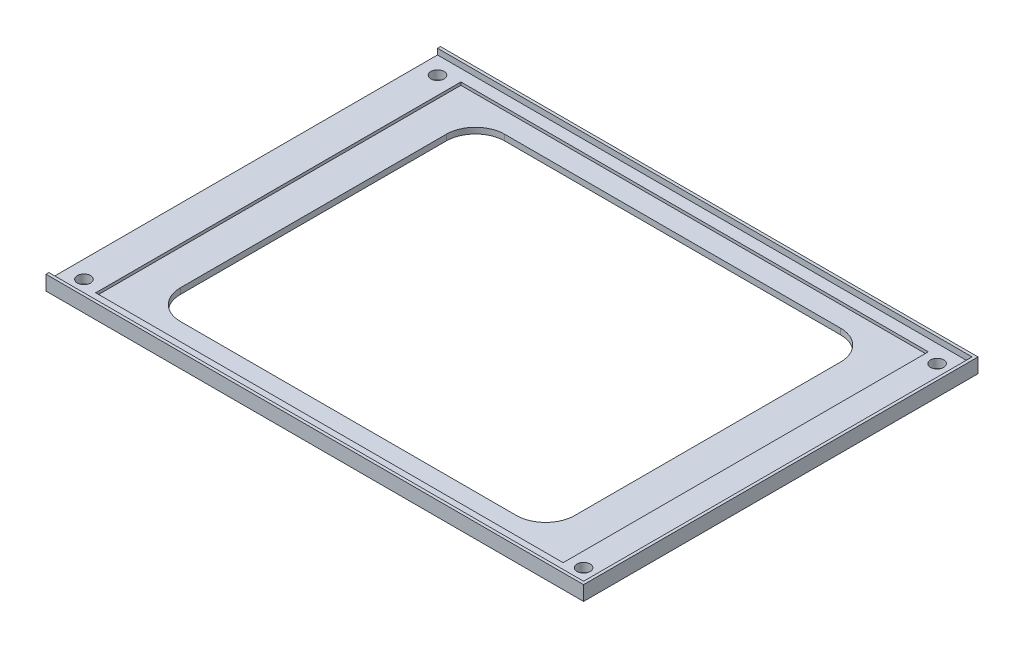
ISO-10303-21;
HEADER;
FILE_DESCRIPTION(('STEP AP214'),'2;1');
FILE_NAME('part.step','',(''),(''),'','','');
FILE_SCHEMA(('AUTOMOTIVE_DESIGN { 1 0 10303 214 1 1 1 1 }'));
ENDSEC;
DATA;
#1=APPLICATION_CONTEXT('core data for automotive mechanical design processes');
#2=APPLICATION_PROTOCOL_DEFINITION('international standard','automotive_design',2000,#1);
#3=PRODUCT_CONTEXT('',#1,'mechanical');
#4=PRODUCT('Part','Part','',(#3));
#5=PRODUCT_RELATED_PRODUCT_CATEGORY('part','',(#4));
#6=PRODUCT_DEFINITION_FORMATION('','',#4);
#7=PRODUCT_DEFINITION_CONTEXT('part definition',#1,'design');
#8=PRODUCT_DEFINITION('design','',#6,#7);
#9=PRODUCT_DEFINITION_SHAPE('','',#8);
#10=(LENGTH_UNIT() NAMED_UNIT(*) SI_UNIT(.MILLI.,.METRE.));
#11=(NAMED_UNIT(*) PLANE_ANGLE_UNIT() SI_UNIT($,.RADIAN.));
#12=(NAMED_UNIT(*) SI_UNIT($,.STERADIAN.) SOLID_ANGLE_UNIT());
#13=UNCERTAINTY_MEASURE_WITH_UNIT(LENGTH_MEASURE(1.E-05),#10,'distance_accuracy_value','');
#14=(GEOMETRIC_REPRESENTATION_CONTEXT(3) GLOBAL_UNCERTAINTY_ASSIGNED_CONTEXT((#13)) GLOBAL_UNIT_ASSIGNED_CONTEXT((#10,
#11,#12)) REPRESENTATION_CONTEXT('',''));
#15=CARTESIAN_POINT('',(0.,0.,0.));
#16=DIRECTION('',(0.,0.,1.));
#17=DIRECTION('',(1.,0.,0.));
#18=AXIS2_PLACEMENT_3D('',#15,#16,#17);
#19=CARTESIAN_POINT('',(0.,2.,0.));
#20=DIRECTION('',(0.,1.,0.));
#21=DIRECTION('',(0.,0.,1.));
#22=AXIS2_PLACEMENT_3D('',#19,#20,#21);
#23=PLANE('',#22);
#24=DIRECTION('',(0.,0.,1.));
#25=VECTOR('',#24,1.);
#26=CARTESIAN_POINT('',(-5.27724760138826,2.,-45.5));
#27=LINE('',#26,#25);
#28=CARTESIAN_POINT('',(-5.27724760138826,2.,-45.5));
#29=VERTEX_POINT('',#28);
#30=CARTESIAN_POINT('',(-5.27724760138825,2.,45.5));
#31=VERTEX_POINT('',#30);
#32=EDGE_CURVE('E264',#29,#31,#27,.T.);
#33=ORIENTED_EDGE('',*,*,#32,.F.);
#34=CARTESIAN_POINT('',(4.72275239861174,2.,-45.5));
#35=DIRECTION('',(0.,1.,0.));
#36=DIRECTION('',(0.,0.,1.));
#37=AXIS2_PLACEMENT_3D('',#34,#35,#36);
#38=CIRCLE('',#37,10.);
#39=CARTESIAN_POINT('',(4.72275239861174,2.,-55.5));
#40=VERTEX_POINT('',#39);
#41=EDGE_CURVE('E261',#40,#29,#38,.T.);
#42=ORIENTED_EDGE('',*,*,#41,.F.);
#43=DIRECTION('',(-1.,0.,0.));
#44=VECTOR('',#43,1.);
#45=CARTESIAN_POINT('',(4.72275239861174,2.,-55.5));
#46=LINE('',#45,#44);
#47=CARTESIAN_POINT('',(119.722752398612,2.,-55.5));
#48=VERTEX_POINT('',#47);
#49=EDGE_CURVE('E284',#48,#40,#46,.T.);
#50=ORIENTED_EDGE('',*,*,#49,.F.);
#51=CARTESIAN_POINT('',(119.722752398612,2.,-45.5));
#52=DIRECTION('',(0.,1.,0.));
#53=DIRECTION('',(0.,0.,-1.));
#54=AXIS2_PLACEMENT_3D('',#51,#52,#53);
#55=CIRCLE('',#54,10.);
#56=CARTESIAN_POINT('',(129.722752398612,2.,-45.5));
#57=VERTEX_POINT('',#56);
#58=EDGE_CURVE('E280',#57,#48,#55,.T.);
#59=ORIENTED_EDGE('',*,*,#58,.F.);
#60=DIRECTION('',(0.,0.,-1.));
#61=VECTOR('',#60,1.);
#62=CARTESIAN_POINT('',(129.722752398612,2.,-45.5));
#63=LINE('',#62,#61);
#64=CARTESIAN_POINT('',(129.722752398612,2.,45.5));
#65=VERTEX_POINT('',#64);
#66=EDGE_CURVE('E277',#65,#57,#63,.T.);
#67=ORIENTED_EDGE('',*,*,#66,.F.);
#68=CARTESIAN_POINT('',(119.722752398612,2.,45.5));
#69=DIRECTION('',(0.,1.,0.));
#70=DIRECTION('',(0.,0.,1.));
#71=AXIS2_PLACEMENT_3D('',#68,#69,#70);
#72=CIRCLE('',#71,9.99999999999998);
#73=CARTESIAN_POINT('',(119.722752398612,2.,55.5));
#74=VERTEX_POINT('',#73);
#75=EDGE_CURVE('E274',#74,#65,#72,.T.);
#76=ORIENTED_EDGE('',*,*,#75,.F.);
#77=DIRECTION('',(1.,0.,0.));
#78=VECTOR('',#77,1.);
#79=CARTESIAN_POINT('',(4.72275239861175,2.,55.5));
#80=LINE('',#79,#78);
#81=CARTESIAN_POINT('',(4.72275239861175,2.,55.5));
#82=VERTEX_POINT('',#81);
#83=EDGE_CURVE('E271',#82,#74,#80,.T.);
#84=ORIENTED_EDGE('',*,*,#83,.F.);
#85=CARTESIAN_POINT('',(4.72275239861175,2.,45.5));
#86=DIRECTION('',(0.,1.,0.));
#87=DIRECTION('',(0.,0.,1.));
#88=AXIS2_PLACEMENT_3D('',#85,#86,#87);
#89=CIRCLE('',#88,10.);
#90=EDGE_CURVE('E268',#31,#82,#89,.T.);
#91=ORIENTED_EDGE('',*,*,#90,.F.);
#92=EDGE_LOOP('',(#33,#42,#50,#59,#67,#76,#84,#91));
#93=FACE_BOUND('',#92,.T.);
#94=DIRECTION('',(-1.,0.,0.));
#95=VECTOR('',#94,1.);
#96=CARTESIAN_POINT('',(-17.2772476013882,2.,-62.5));
#97=LINE('',#96,#95);
#98=CARTESIAN_POINT('',(142.722752398612,2.,-62.5));
#99=VERTEX_POINT('',#98);
#100=CARTESIAN_POINT('',(-17.2772476013882,2.,-62.5));
#101=VERTEX_POINT('',#100);
#102=EDGE_CURVE('E225',#99,#101,#97,.T.);
#103=ORIENTED_EDGE('',*,*,#102,.T.);
#104=DIRECTION('',(0.,0.,1.));
#105=VECTOR('',#104,1.);
#106=CARTESIAN_POINT('',(-17.2772476013882,2.,-62.5));
#107=LINE('',#106,#105);
#108=CARTESIAN_POINT('',(-17.2772476013882,2.,62.5));
#109=VERTEX_POINT('',#108);
#110=EDGE_CURVE('E210',#101,#109,#107,.T.);
#111=ORIENTED_EDGE('',*,*,#110,.T.);
#112=DIRECTION('',(1.,0.,0.));
#113=VECTOR('',#112,1.);
#114=CARTESIAN_POINT('',(-17.2772476013882,2.,62.5));
#115=LINE('',#114,#113);
#116=CARTESIAN_POINT('',(142.722752398612,2.,62.5));
#117=VERTEX_POINT('',#116);
#118=EDGE_CURVE('E215',#109,#117,#115,.T.);
#119=ORIENTED_EDGE('',*,*,#118,.T.);
#120=DIRECTION('',(0.,0.,-1.));
#121=VECTOR('',#120,1.);
#122=CARTESIAN_POINT('',(142.722752398612,2.,-62.5));
#123=LINE('',#122,#121);
#124=EDGE_CURVE('E239',#117,#99,#123,.T.);
#125=ORIENTED_EDGE('',*,*,#124,.T.);
#126=EDGE_LOOP('',(#103,#111,#119,#125));
#127=FACE_BOUND('',#126,.T.);
#128=ADVANCED_FACE('F45',(#93,#127),#23,.T.);
#129=CARTESIAN_POINT('',(0.,0.,0.));
#130=DIRECTION('',(0.,1.,0.));
#131=DIRECTION('',(0.,0.,1.));
#132=AXIS2_PLACEMENT_3D('',#129,#130,#131);
#133=PLANE('',#132);
#134=CARTESIAN_POINT('',(147.722752398612,0.,60.5));
#135=DIRECTION('',(0.,-1.,0.));
#136=DIRECTION('',(0.,0.,-1.));
#137=AXIS2_PLACEMENT_3D('',#134,#135,#136);
#138=CIRCLE('',#137,2.25000000000001);
#139=CARTESIAN_POINT('',(147.722752398612,0.,58.25));
#140=VERTEX_POINT('',#139);
#141=EDGE_CURVE('E415',#140,#140,#138,.T.);
#142=ORIENTED_EDGE('',*,*,#141,.F.);
#143=EDGE_LOOP('',(#142));
#144=FACE_BOUND('',#143,.T.);
#145=CARTESIAN_POINT('',(147.722752398612,0.,-60.5));
#146=DIRECTION('',(0.,-1.,0.));
#147=DIRECTION('',(0.,0.,-1.));
#148=AXIS2_PLACEMENT_3D('',#145,#146,#147);
#149=CIRCLE('',#148,2.25000000000001);
#150=CARTESIAN_POINT('',(147.722752398612,0.,-62.75));
#151=VERTEX_POINT('',#150);
#152=EDGE_CURVE('E423',#151,#151,#149,.T.);
#153=ORIENTED_EDGE('',*,*,#152,.F.);
#154=EDGE_LOOP('',(#153));
#155=FACE_BOUND('',#154,.T.);
#156=CARTESIAN_POINT('',(-23.2772476013882,0.,-60.5));
#157=DIRECTION('',(0.,-1.,0.));
#158=DIRECTION('',(0.,0.,-1.));
#159=AXIS2_PLACEMENT_3D('',#156,#157,#158);
#160=CIRCLE('',#159,2.25);
#161=CARTESIAN_POINT('',(-23.2772476013882,0.,-62.75));
#162=VERTEX_POINT('',#161);
#163=EDGE_CURVE('E407',#162,#162,#160,.T.);
#164=ORIENTED_EDGE('',*,*,#163,.F.);
#165=EDGE_LOOP('',(#164));
#166=FACE_BOUND('',#165,.T.);
#167=CARTESIAN_POINT('',(-23.2772476013882,0.,60.5));
#168=DIRECTION('',(0.,-1.,0.));
#169=DIRECTION('',(0.,0.,-1.));
#170=AXIS2_PLACEMENT_3D('',#167,#168,#169);
#171=CIRCLE('',#170,2.25);
#172=CARTESIAN_POINT('',(-23.2772476013882,0.,58.25));
#173=VERTEX_POINT('',#172);
#174=EDGE_CURVE('E406',#173,#173,#171,.T.);
#175=ORIENTED_EDGE('',*,*,#174,.F.);
#176=EDGE_LOOP('',(#175));
#177=FACE_BOUND('',#176,.T.);
#178=DIRECTION('',(0.,0.,1.));
#179=VECTOR('',#178,1.);
#180=CARTESIAN_POINT('',(-29.2772476013882,0.,-67.5));
#181=LINE('',#180,#179);
#182=CARTESIAN_POINT('',(-29.2772476013882,0.,-67.5));
#183=VERTEX_POINT('',#182);
#184=CARTESIAN_POINT('',(-29.2772476013882,0.,67.5));
#185=VERTEX_POINT('',#184);
#186=EDGE_CURVE('E343',#183,#185,#181,.T.);
#187=ORIENTED_EDGE('',*,*,#186,.F.);
#188=DIRECTION('',(-1.,0.,0.));
#189=VECTOR('',#188,1.);
#190=CARTESIAN_POINT('',(-29.2772476013882,0.,-67.5));
#191=LINE('',#190,#189);
#192=CARTESIAN_POINT('',(154.722752398612,0.,-67.5));
#193=VERTEX_POINT('',#192);
#194=EDGE_CURVE('E353',#193,#183,#191,.T.);
#195=ORIENTED_EDGE('',*,*,#194,.F.);
#196=DIRECTION('',(0.,0.,-1.));
#197=VECTOR('',#196,1.);
#198=CARTESIAN_POINT('',(154.722752398612,0.,-67.5));
#199=LINE('',#198,#197);
#200=CARTESIAN_POINT('',(154.722752398612,0.,67.5));
#201=VERTEX_POINT('',#200);
#202=EDGE_CURVE('E350',#201,#193,#199,.T.);
#203=ORIENTED_EDGE('',*,*,#202,.F.);
#204=DIRECTION('',(1.,0.,0.));
#205=VECTOR('',#204,1.);
#206=CARTESIAN_POINT('',(-29.2772476013882,0.,67.5));
#207=LINE('',#206,#205);
#208=EDGE_CURVE('E347',#185,#201,#207,.T.);
#209=ORIENTED_EDGE('',*,*,#208,.F.);
#210=EDGE_LOOP('',(#187,#195,#203,#209));
#211=FACE_BOUND('',#210,.T.);
#212=CARTESIAN_POINT('',(4.72275239861174,0.,-45.5));
#213=DIRECTION('',(0.,1.,0.));
#214=DIRECTION('',(0.,0.,1.));
#215=AXIS2_PLACEMENT_3D('',#212,#213,#214);
#216=CIRCLE('',#215,10.);
#217=CARTESIAN_POINT('',(4.72275239861174,0.,-55.5));
#218=VERTEX_POINT('',#217);
#219=CARTESIAN_POINT('',(-5.27724760138826,0.,-45.5));
#220=VERTEX_POINT('',#219);
#221=EDGE_CURVE('E260',#218,#220,#216,.T.);
#222=ORIENTED_EDGE('',*,*,#221,.T.);
#223=DIRECTION('',(0.,0.,1.));
#224=VECTOR('',#223,1.);
#225=CARTESIAN_POINT('',(-5.27724760138826,0.,-45.5));
#226=LINE('',#225,#224);
#227=CARTESIAN_POINT('',(-5.27724760138825,0.,45.5));
#228=VERTEX_POINT('',#227);
#229=EDGE_CURVE('E291',#220,#228,#226,.T.);
#230=ORIENTED_EDGE('',*,*,#229,.T.);
#231=CARTESIAN_POINT('',(4.72275239861175,0.,45.5));
#232=DIRECTION('',(0.,1.,0.));
#233=DIRECTION('',(0.,0.,1.));
#234=AXIS2_PLACEMENT_3D('',#231,#232,#233);
#235=CIRCLE('',#234,10.);
#236=CARTESIAN_POINT('',(4.72275239861175,0.,55.5));
#237=VERTEX_POINT('',#236);
#238=EDGE_CURVE('E295',#228,#237,#235,.T.);
#239=ORIENTED_EDGE('',*,*,#238,.T.);
#240=DIRECTION('',(1.,0.,0.));
#241=VECTOR('',#240,1.);
#242=CARTESIAN_POINT('',(4.72275239861175,0.,55.5));
#243=LINE('',#242,#241);
#244=CARTESIAN_POINT('',(119.722752398612,0.,55.5));
#245=VERTEX_POINT('',#244);
#246=EDGE_CURVE('E299',#237,#245,#243,.T.);
#247=ORIENTED_EDGE('',*,*,#246,.T.);
#248=CARTESIAN_POINT('',(119.722752398612,0.,45.5));
#249=DIRECTION('',(0.,1.,0.));
#250=DIRECTION('',(0.,0.,1.));
#251=AXIS2_PLACEMENT_3D('',#248,#249,#250);
#252=CIRCLE('',#251,9.99999999999998);
#253=CARTESIAN_POINT('',(129.722752398612,0.,45.5));
#254=VERTEX_POINT('',#253);
#255=EDGE_CURVE('E303',#245,#254,#252,.T.);
#256=ORIENTED_EDGE('',*,*,#255,.T.);
#257=DIRECTION('',(0.,0.,-1.));
#258=VECTOR('',#257,1.);
#259=CARTESIAN_POINT('',(129.722752398612,0.,-45.5));
#260=LINE('',#259,#258);
#261=CARTESIAN_POINT('',(129.722752398612,0.,-45.5));
#262=VERTEX_POINT('',#261);
#263=EDGE_CURVE('E307',#254,#262,#260,.T.);
#264=ORIENTED_EDGE('',*,*,#263,.T.);
#265=CARTESIAN_POINT('',(119.722752398612,0.,-45.5));
#266=DIRECTION('',(0.,1.,0.));
#267=DIRECTION('',(0.,0.,-1.));
#268=AXIS2_PLACEMENT_3D('',#265,#266,#267);
#269=CIRCLE('',#268,10.);
#270=CARTESIAN_POINT('',(119.722752398612,0.,-55.5));
#271=VERTEX_POINT('',#270);
#272=EDGE_CURVE('E311',#262,#271,#269,.T.);
#273=ORIENTED_EDGE('',*,*,#272,.T.);
#274=DIRECTION('',(-1.,0.,0.));
#275=VECTOR('',#274,1.);
#276=CARTESIAN_POINT('',(4.72275239861174,0.,-55.5));
#277=LINE('',#276,#275);
#278=EDGE_CURVE('E265',#271,#218,#277,.T.);
#279=ORIENTED_EDGE('',*,*,#278,.T.);
#280=EDGE_LOOP('',(#222,#230,#239,#247,#256,#264,#273,#279));
#281=FACE_BOUND('',#280,.T.);
#282=ADVANCED_FACE('F377',(#144,#155,#166,#177,#211,#281),#133,.F.);
#283=CARTESIAN_POINT('',(-29.2772476013882,2.,-67.5));
#284=DIRECTION('',(1.,0.,0.));
#285=DIRECTION('',(0.,0.,-1.));
#286=AXIS2_PLACEMENT_3D('',#283,#284,#285);
#287=PLANE('',#286);
#288=ORIENTED_EDGE('',*,*,#186,.T.);
#289=DIRECTION('',(0.,-1.,0.));
#290=VECTOR('',#289,1.);
#291=CARTESIAN_POINT('',(-29.2772476013882,2.,67.5));
#292=LINE('',#291,#290);
#293=CARTESIAN_POINT('',(-29.2772476013882,5.,67.5));
#294=VERTEX_POINT('',#293);
#295=EDGE_CURVE('E11',#294,#185,#292,.T.);
#296=ORIENTED_EDGE('',*,*,#295,.F.);
#297=DIRECTION('',(0.,0.,1.));
#298=VECTOR('',#297,1.);
#299=CARTESIAN_POINT('',(-29.2772476013882,5.,0.));
#300=LINE('',#299,#298);
#301=CARTESIAN_POINT('',(-29.2772476013882,5.,66.5));
#302=VERTEX_POINT('',#301);
#303=EDGE_CURVE('E387',#302,#294,#300,.T.);
#304=ORIENTED_EDGE('',*,*,#303,.F.);
#305=DIRECTION('',(0.,-1.,0.));
#306=VECTOR('',#305,1.);
#307=CARTESIAN_POINT('',(-29.2772476013882,5.,66.5));
#308=LINE('',#307,#306);
#309=CARTESIAN_POINT('',(-29.2772476013882,3.,66.5));
#310=VERTEX_POINT('',#309);
#311=EDGE_CURVE('E217',#302,#310,#308,.T.);
#312=ORIENTED_EDGE('',*,*,#311,.T.);
#313=DIRECTION('',(0.,0.,1.));
#314=VECTOR('',#313,1.);
#315=CARTESIAN_POINT('',(-29.2772476013882,3.,-67.5));
#316=LINE('',#315,#314);
#317=CARTESIAN_POINT('',(-29.2772476013882,3.,-66.5));
#318=VERTEX_POINT('',#317);
#319=EDGE_CURVE('E66',#318,#310,#316,.T.);
#320=ORIENTED_EDGE('',*,*,#319,.F.);
#321=DIRECTION('',(0.,-1.,0.));
#322=VECTOR('',#321,1.);
#323=CARTESIAN_POINT('',(-29.2772476013882,5.,-66.5));
#324=LINE('',#323,#322);
#325=CARTESIAN_POINT('',(-29.2772476013882,5.,-66.5));
#326=VERTEX_POINT('',#325);
#327=EDGE_CURVE('E383',#326,#318,#324,.T.);
#328=ORIENTED_EDGE('',*,*,#327,.F.);
#329=CARTESIAN_POINT('',(-29.2772476013882,5.,-67.5));
#330=VERTEX_POINT('',#329);
#331=EDGE_CURVE('E200',#330,#326,#300,.T.);
#332=ORIENTED_EDGE('',*,*,#331,.F.);
#333=DIRECTION('',(0.,-1.,0.));
#334=VECTOR('',#333,1.);
#335=CARTESIAN_POINT('',(-29.2772476013882,2.,-67.5));
#336=LINE('',#335,#334);
#337=EDGE_CURVE('E356',#330,#183,#336,.T.);
#338=ORIENTED_EDGE('',*,*,#337,.T.);
#339=EDGE_LOOP('',(#288,#296,#304,#312,#320,#328,#332,#338));
#340=FACE_BOUND('',#339,.T.);
#341=ADVANCED_FACE('F47',(#340),#287,.F.);
#342=CARTESIAN_POINT('',(-29.2772476013882,2.,67.5));
#343=DIRECTION('',(0.,0.,-1.));
#344=DIRECTION('',(-1.,0.,0.));
#345=AXIS2_PLACEMENT_3D('',#342,#343,#344);
#346=PLANE('',#345);
#347=ORIENTED_EDGE('',*,*,#208,.T.);
#348=DIRECTION('',(0.,-1.,0.));
#349=VECTOR('',#348,1.);
#350=CARTESIAN_POINT('',(154.722752398612,2.,67.5));
#351=LINE('',#350,#349);
#352=CARTESIAN_POINT('',(154.722752398612,5.,67.5));
#353=VERTEX_POINT('',#352);
#354=EDGE_CURVE('E54',#353,#201,#351,.T.);
#355=ORIENTED_EDGE('',*,*,#354,.F.);
#356=DIRECTION('',(1.,0.,0.));
#357=VECTOR('',#356,1.);
#358=CARTESIAN_POINT('',(0.,5.,67.5));
#359=LINE('',#358,#357);
#360=EDGE_CURVE('E396',#294,#353,#359,.T.);
#361=ORIENTED_EDGE('',*,*,#360,.F.);
#362=ORIENTED_EDGE('',*,*,#295,.T.);
#363=EDGE_LOOP('',(#347,#355,#361,#362));
#364=FACE_BOUND('',#363,.T.);
#365=ADVANCED_FACE('F475',(#364),#346,.F.);
#366=CARTESIAN_POINT('',(154.722752398612,2.,-67.5));
#367=DIRECTION('',(-1.,0.,0.));
#368=DIRECTION('',(0.,0.,1.));
#369=AXIS2_PLACEMENT_3D('',#366,#367,#368);
#370=PLANE('',#369);
#371=ORIENTED_EDGE('',*,*,#202,.T.);
#372=DIRECTION('',(0.,-1.,0.));
#373=VECTOR('',#372,1.);
#374=CARTESIAN_POINT('',(154.722752398612,2.,-67.5));
#375=LINE('',#374,#373);
#376=CARTESIAN_POINT('',(154.722752398612,5.,-67.5));
#377=VERTEX_POINT('',#376);
#378=EDGE_CURVE('E360',#377,#193,#375,.T.);
#379=ORIENTED_EDGE('',*,*,#378,.F.);
#380=DIRECTION('',(0.,0.,-1.));
#381=VECTOR('',#380,1.);
#382=CARTESIAN_POINT('',(154.722752398612,5.,0.));
#383=LINE('',#382,#381);
#384=EDGE_CURVE('E370',#353,#377,#383,.T.);
#385=ORIENTED_EDGE('',*,*,#384,.F.);
#386=ORIENTED_EDGE('',*,*,#354,.T.);
#387=EDGE_LOOP('',(#371,#379,#385,#386));
#388=FACE_BOUND('',#387,.T.);
#389=ADVANCED_FACE('F368',(#388),#370,.F.);
#390=CARTESIAN_POINT('',(-29.2772476013882,2.,-67.5));
#391=DIRECTION('',(0.,0.,1.));
#392=DIRECTION('',(1.,0.,0.));
#393=AXIS2_PLACEMENT_3D('',#390,#391,#392);
#394=PLANE('',#393);
#395=ORIENTED_EDGE('',*,*,#194,.T.);
#396=ORIENTED_EDGE('',*,*,#337,.F.);
#397=DIRECTION('',(-1.,0.,0.));
#398=VECTOR('',#397,1.);
#399=CARTESIAN_POINT('',(0.,5.,-67.5));
#400=LINE('',#399,#398);
#401=EDGE_CURVE('E385',#377,#330,#400,.T.);
#402=ORIENTED_EDGE('',*,*,#401,.F.);
#403=ORIENTED_EDGE('',*,*,#378,.T.);
#404=EDGE_LOOP('',(#395,#396,#402,#403));
#405=FACE_BOUND('',#404,.T.);
#406=ADVANCED_FACE('F380',(#405),#394,.F.);
#407=CARTESIAN_POINT('',(4.72275239861174,2.,-45.5));
#408=DIRECTION('',(0.,-1.,0.));
#409=DIRECTION('',(0.,0.,-1.));
#410=AXIS2_PLACEMENT_3D('',#407,#408,#409);
#411=CYLINDRICAL_SURFACE('',#410,10.);
#412=ORIENTED_EDGE('',*,*,#221,.F.);
#413=DIRECTION('',(0.,-1.,0.));
#414=VECTOR('',#413,1.);
#415=CARTESIAN_POINT('',(4.72275239861174,2.,-55.5));
#416=LINE('',#415,#414);
#417=EDGE_CURVE('E287',#40,#218,#416,.T.);
#418=ORIENTED_EDGE('',*,*,#417,.F.);
#419=ORIENTED_EDGE('',*,*,#41,.T.);
#420=DIRECTION('',(0.,-1.,0.));
#421=VECTOR('',#420,1.);
#422=CARTESIAN_POINT('',(-5.27724760138826,2.,-45.5));
#423=LINE('',#422,#421);
#424=EDGE_CURVE('E339',#29,#220,#423,.T.);
#425=ORIENTED_EDGE('',*,*,#424,.T.);
#426=EDGE_LOOP('',(#412,#418,#419,#425));
#427=FACE_BOUND('',#426,.T.);
#428=ADVANCED_FACE('F469',(#427),#411,.F.);
#429=CARTESIAN_POINT('',(-5.27724760138826,2.,-45.5));
#430=DIRECTION('',(1.,0.,0.));
#431=DIRECTION('',(0.,0.,-1.));
#432=AXIS2_PLACEMENT_3D('',#429,#430,#431);
#433=PLANE('',#432);
#434=ORIENTED_EDGE('',*,*,#229,.F.);
#435=ORIENTED_EDGE('',*,*,#424,.F.);
#436=ORIENTED_EDGE('',*,*,#32,.T.);
#437=DIRECTION('',(0.,-1.,0.));
#438=VECTOR('',#437,1.);
#439=CARTESIAN_POINT('',(-5.27724760138825,2.,45.5));
#440=LINE('',#439,#438);
#441=EDGE_CURVE('E336',#31,#228,#440,.T.);
#442=ORIENTED_EDGE('',*,*,#441,.T.);
#443=EDGE_LOOP('',(#434,#435,#436,#442));
#444=FACE_BOUND('',#443,.T.);
#445=ADVANCED_FACE('F546',(#444),#433,.T.);
#446=CARTESIAN_POINT('',(4.72275239861175,2.,45.5));
#447=DIRECTION('',(0.,-1.,0.));
#448=DIRECTION('',(0.,0.,-1.));
#449=AXIS2_PLACEMENT_3D('',#446,#447,#448);
#450=CYLINDRICAL_SURFACE('',#449,10.);
#451=ORIENTED_EDGE('',*,*,#238,.F.);
#452=ORIENTED_EDGE('',*,*,#441,.F.);
#453=ORIENTED_EDGE('',*,*,#90,.T.);
#454=DIRECTION('',(0.,-1.,0.));
#455=VECTOR('',#454,1.);
#456=CARTESIAN_POINT('',(4.72275239861175,2.,55.5));
#457=LINE('',#456,#455);
#458=EDGE_CURVE('E333',#82,#237,#457,.T.);
#459=ORIENTED_EDGE('',*,*,#458,.T.);
#460=EDGE_LOOP('',(#451,#452,#453,#459));
#461=FACE_BOUND('',#460,.T.);
#462=ADVANCED_FACE('F543',(#461),#450,.F.);
#463=CARTESIAN_POINT('',(4.72275239861175,2.,55.5));
#464=DIRECTION('',(0.,0.,-1.));
#465=DIRECTION('',(-1.,0.,0.));
#466=AXIS2_PLACEMENT_3D('',#463,#464,#465);
#467=PLANE('',#466);
#468=ORIENTED_EDGE('',*,*,#246,.F.);
#469=ORIENTED_EDGE('',*,*,#458,.F.);
#470=ORIENTED_EDGE('',*,*,#83,.T.);
#471=DIRECTION('',(0.,-1.,0.));
#472=VECTOR('',#471,1.);
#473=CARTESIAN_POINT('',(119.722752398612,2.,55.5));
#474=LINE('',#473,#472);
#475=EDGE_CURVE('E330',#74,#245,#474,.T.);
#476=ORIENTED_EDGE('',*,*,#475,.T.);
#477=EDGE_LOOP('',(#468,#469,#470,#476));
#478=FACE_BOUND('',#477,.T.);
#479=ADVANCED_FACE('F539',(#478),#467,.T.);
#480=CARTESIAN_POINT('',(119.722752398612,2.,45.5));
#481=DIRECTION('',(0.,-1.,0.));
#482=DIRECTION('',(0.,0.,-1.));
#483=AXIS2_PLACEMENT_3D('',#480,#481,#482);
#484=CYLINDRICAL_SURFACE('',#483,9.99999999999998);
#485=ORIENTED_EDGE('',*,*,#255,.F.);
#486=ORIENTED_EDGE('',*,*,#475,.F.);
#487=ORIENTED_EDGE('',*,*,#75,.T.);
#488=DIRECTION('',(0.,-1.,0.));
#489=VECTOR('',#488,1.);
#490=CARTESIAN_POINT('',(129.722752398612,2.,45.5));
#491=LINE('',#490,#489);
#492=EDGE_CURVE('E327',#65,#254,#491,.T.);
#493=ORIENTED_EDGE('',*,*,#492,.T.);
#494=EDGE_LOOP('',(#485,#486,#487,#493));
#495=FACE_BOUND('',#494,.T.);
#496=ADVANCED_FACE('F535',(#495),#484,.F.);
#497=CARTESIAN_POINT('',(129.722752398612,2.,-45.5));
#498=DIRECTION('',(-1.,0.,0.));
#499=DIRECTION('',(0.,0.,1.));
#500=AXIS2_PLACEMENT_3D('',#497,#498,#499);
#501=PLANE('',#500);
#502=ORIENTED_EDGE('',*,*,#263,.F.);
#503=ORIENTED_EDGE('',*,*,#492,.F.);
#504=ORIENTED_EDGE('',*,*,#66,.T.);
#505=DIRECTION('',(0.,-1.,0.));
#506=VECTOR('',#505,1.);
#507=CARTESIAN_POINT('',(129.722752398612,2.,-45.5));
#508=LINE('',#507,#506);
#509=EDGE_CURVE('E324',#57,#262,#508,.T.);
#510=ORIENTED_EDGE('',*,*,#509,.T.);
#511=EDGE_LOOP('',(#502,#503,#504,#510));
#512=FACE_BOUND('',#511,.T.);
#513=ADVANCED_FACE('F531',(#512),#501,.T.);
#514=CARTESIAN_POINT('',(119.722752398612,2.,-45.5));
#515=DIRECTION('',(0.,-1.,0.));
#516=DIRECTION('',(0.,0.,-1.));
#517=AXIS2_PLACEMENT_3D('',#514,#515,#516);
#518=CYLINDRICAL_SURFACE('',#517,10.);
#519=ORIENTED_EDGE('',*,*,#272,.F.);
#520=ORIENTED_EDGE('',*,*,#509,.F.);
#521=ORIENTED_EDGE('',*,*,#58,.T.);
#522=DIRECTION('',(0.,-1.,0.));
#523=VECTOR('',#522,1.);
#524=CARTESIAN_POINT('',(119.722752398612,2.,-55.5));
#525=LINE('',#524,#523);
#526=EDGE_CURVE('E321',#48,#271,#525,.T.);
#527=ORIENTED_EDGE('',*,*,#526,.T.);
#528=EDGE_LOOP('',(#519,#520,#521,#527));
#529=FACE_BOUND('',#528,.T.);
#530=ADVANCED_FACE('F527',(#529),#518,.F.);
#531=CARTESIAN_POINT('',(4.72275239861174,2.,-55.5));
#532=DIRECTION('',(0.,0.,1.));
#533=DIRECTION('',(1.,0.,0.));
#534=AXIS2_PLACEMENT_3D('',#531,#532,#533);
#535=PLANE('',#534);
#536=ORIENTED_EDGE('',*,*,#278,.F.);
#537=ORIENTED_EDGE('',*,*,#526,.F.);
#538=ORIENTED_EDGE('',*,*,#49,.T.);
#539=ORIENTED_EDGE('',*,*,#417,.T.);
#540=EDGE_LOOP('',(#536,#537,#538,#539));
#541=FACE_BOUND('',#540,.T.);
#542=ADVANCED_FACE('F493',(#541),#535,.T.);
#543=CARTESIAN_POINT('',(0.,3.,0.));
#544=DIRECTION('',(0.,1.,0.));
#545=DIRECTION('',(0.,0.,1.));
#546=AXIS2_PLACEMENT_3D('',#543,#544,#545);
#547=PLANE('',#546);
#548=CARTESIAN_POINT('',(147.722752398612,3.,60.5));
#549=DIRECTION('',(0.,1.,0.));
#550=DIRECTION('',(0.,0.,1.));
#551=AXIS2_PLACEMENT_3D('',#548,#549,#550);
#552=CIRCLE('',#551,2.25000000000001);
#553=CARTESIAN_POINT('',(147.722752398612,3.,62.75));
#554=VERTEX_POINT('',#553);
#555=EDGE_CURVE('E411',#554,#554,#552,.F.);
#556=ORIENTED_EDGE('',*,*,#555,.T.);
#557=EDGE_LOOP('',(#556));
#558=FACE_BOUND('',#557,.T.);
#559=CARTESIAN_POINT('',(147.722752398612,3.,-60.5));
#560=DIRECTION('',(0.,1.,0.));
#561=DIRECTION('',(0.,0.,1.));
#562=AXIS2_PLACEMENT_3D('',#559,#560,#561);
#563=CIRCLE('',#562,2.25000000000001);
#564=CARTESIAN_POINT('',(147.722752398612,3.,-58.25));
#565=VERTEX_POINT('',#564);
#566=EDGE_CURVE('E419',#565,#565,#563,.F.);
#567=ORIENTED_EDGE('',*,*,#566,.T.);
#568=EDGE_LOOP('',(#567));
#569=FACE_BOUND('',#568,.T.);
#570=CARTESIAN_POINT('',(-23.2772476013882,3.,-60.5));
#571=DIRECTION('',(0.,1.,0.));
#572=DIRECTION('',(0.,0.,1.));
#573=AXIS2_PLACEMENT_3D('',#570,#571,#572);
#574=CIRCLE('',#573,2.25);
#575=CARTESIAN_POINT('',(-23.2772476013882,3.,-58.25));
#576=VERTEX_POINT('',#575);
#577=EDGE_CURVE('E427',#576,#576,#574,.F.);
#578=ORIENTED_EDGE('',*,*,#577,.T.);
#579=EDGE_LOOP('',(#578));
#580=FACE_BOUND('',#579,.T.);
#581=CARTESIAN_POINT('',(-23.2772476013882,3.,60.5));
#582=DIRECTION('',(0.,1.,0.));
#583=DIRECTION('',(0.,0.,1.));
#584=AXIS2_PLACEMENT_3D('',#581,#582,#583);
#585=CIRCLE('',#584,2.25);
#586=CARTESIAN_POINT('',(-23.2772476013882,3.,62.75));
#587=VERTEX_POINT('',#586);
#588=EDGE_CURVE('E402',#587,#587,#585,.F.);
#589=ORIENTED_EDGE('',*,*,#588,.T.);
#590=EDGE_LOOP('',(#589));
#591=FACE_BOUND('',#590,.T.);
#592=DIRECTION('',(1.,0.,0.));
#593=VECTOR('',#592,1.);
#594=CARTESIAN_POINT('',(0.,3.,-66.5));
#595=LINE('',#594,#593);
#596=CARTESIAN_POINT('',(153.722752398612,3.,-66.5));
#597=VERTEX_POINT('',#596);
#598=EDGE_CURVE('E208',#318,#597,#595,.T.);
#599=ORIENTED_EDGE('',*,*,#598,.F.);
#600=ORIENTED_EDGE('',*,*,#319,.T.);
#601=DIRECTION('',(1.,0.,0.));
#602=VECTOR('',#601,1.);
#603=CARTESIAN_POINT('',(0.,3.,66.5));
#604=LINE('',#603,#602);
#605=CARTESIAN_POINT('',(153.722752398612,3.,66.5));
#606=VERTEX_POINT('',#605);
#607=EDGE_CURVE('E205',#310,#606,#604,.T.);
#608=ORIENTED_EDGE('',*,*,#607,.T.);
#609=DIRECTION('',(0.,0.,1.));
#610=VECTOR('',#609,1.);
#611=CARTESIAN_POINT('',(153.722752398612,3.,0.));
#612=LINE('',#611,#610);
#613=EDGE_CURVE('E61',#597,#606,#612,.T.);
#614=ORIENTED_EDGE('',*,*,#613,.F.);
#615=EDGE_LOOP('',(#599,#600,#608,#614));
#616=FACE_BOUND('',#615,.T.);
#617=DIRECTION('',(1.,0.,0.));
#618=VECTOR('',#617,1.);
#619=CARTESIAN_POINT('',(-17.2772476013882,3.,62.5));
#620=LINE('',#619,#618);
#621=CARTESIAN_POINT('',(-17.2772476013882,3.,62.5));
#622=VERTEX_POINT('',#621);
#623=CARTESIAN_POINT('',(142.722752398612,3.,62.5));
#624=VERTEX_POINT('',#623);
#625=EDGE_CURVE('E224',#622,#624,#620,.T.);
#626=ORIENTED_EDGE('',*,*,#625,.F.);
#627=DIRECTION('',(0.,0.,1.));
#628=VECTOR('',#627,1.);
#629=CARTESIAN_POINT('',(-17.2772476013882,3.,-62.5));
#630=LINE('',#629,#628);
#631=CARTESIAN_POINT('',(-17.2772476013882,3.,-62.5));
#632=VERTEX_POINT('',#631);
#633=EDGE_CURVE('E221',#632,#622,#630,.T.);
#634=ORIENTED_EDGE('',*,*,#633,.F.);
#635=DIRECTION('',(-1.,0.,0.));
#636=VECTOR('',#635,1.);
#637=CARTESIAN_POINT('',(-17.2772476013882,3.,-62.5));
#638=LINE('',#637,#636);
#639=CARTESIAN_POINT('',(142.722752398612,3.,-62.5));
#640=VERTEX_POINT('',#639);
#641=EDGE_CURVE('E232',#640,#632,#638,.T.);
#642=ORIENTED_EDGE('',*,*,#641,.F.);
#643=DIRECTION('',(0.,0.,-1.));
#644=VECTOR('',#643,1.);
#645=CARTESIAN_POINT('',(142.722752398612,3.,-62.5));
#646=LINE('',#645,#644);
#647=EDGE_CURVE('E228',#624,#640,#646,.T.);
#648=ORIENTED_EDGE('',*,*,#647,.F.);
#649=EDGE_LOOP('',(#626,#634,#642,#648));
#650=FACE_BOUND('',#649,.T.);
#651=ADVANCED_FACE('F490',(#558,#569,#580,#591,#616,#650),#547,.T.);
#652=CARTESIAN_POINT('',(-17.2772476013882,3.,-62.5));
#653=DIRECTION('',(1.,0.,0.));
#654=DIRECTION('',(0.,0.,-1.));
#655=AXIS2_PLACEMENT_3D('',#652,#653,#654);
#656=PLANE('',#655);
#657=ORIENTED_EDGE('',*,*,#110,.F.);
#658=DIRECTION('',(0.,-1.,0.));
#659=VECTOR('',#658,1.);
#660=CARTESIAN_POINT('',(-17.2772476013882,3.,-62.5));
#661=LINE('',#660,#659);
#662=EDGE_CURVE('E234',#632,#101,#661,.T.);
#663=ORIENTED_EDGE('',*,*,#662,.F.);
#664=ORIENTED_EDGE('',*,*,#633,.T.);
#665=DIRECTION('',(0.,-1.,0.));
#666=VECTOR('',#665,1.);
#667=CARTESIAN_POINT('',(-17.2772476013882,3.,62.5));
#668=LINE('',#667,#666);
#669=EDGE_CURVE('E254',#622,#109,#668,.T.);
#670=ORIENTED_EDGE('',*,*,#669,.T.);
#671=EDGE_LOOP('',(#657,#663,#664,#670));
#672=FACE_BOUND('',#671,.T.);
#673=ADVANCED_FACE('F492',(#672),#656,.T.);
#674=CARTESIAN_POINT('',(-17.2772476013882,3.,62.5));
#675=DIRECTION('',(0.,0.,-1.));
#676=DIRECTION('',(-1.,0.,0.));
#677=AXIS2_PLACEMENT_3D('',#674,#675,#676);
#678=PLANE('',#677);
#679=ORIENTED_EDGE('',*,*,#118,.F.);
#680=ORIENTED_EDGE('',*,*,#669,.F.);
#681=ORIENTED_EDGE('',*,*,#625,.T.);
#682=DIRECTION('',(0.,-1.,0.));
#683=VECTOR('',#682,1.);
#684=CARTESIAN_POINT('',(142.722752398612,3.,62.5));
#685=LINE('',#684,#683);
#686=EDGE_CURVE('E251',#624,#117,#685,.T.);
#687=ORIENTED_EDGE('',*,*,#686,.T.);
#688=EDGE_LOOP('',(#679,#680,#681,#687));
#689=FACE_BOUND('',#688,.T.);
#690=ADVANCED_FACE('F503',(#689),#678,.T.);
#691=CARTESIAN_POINT('',(142.722752398612,3.,-62.5));
#692=DIRECTION('',(-1.,0.,0.));
#693=DIRECTION('',(0.,0.,1.));
#694=AXIS2_PLACEMENT_3D('',#691,#692,#693);
#695=PLANE('',#694);
#696=ORIENTED_EDGE('',*,*,#124,.F.);
#697=ORIENTED_EDGE('',*,*,#686,.F.);
#698=ORIENTED_EDGE('',*,*,#647,.T.);
#699=DIRECTION('',(0.,-1.,0.));
#700=VECTOR('',#699,1.);
#701=CARTESIAN_POINT('',(142.722752398612,3.,-62.5));
#702=LINE('',#701,#700);
#703=EDGE_CURVE('E248',#640,#99,#702,.T.);
#704=ORIENTED_EDGE('',*,*,#703,.T.);
#705=EDGE_LOOP('',(#696,#697,#698,#704));
#706=FACE_BOUND('',#705,.T.);
#707=ADVANCED_FACE('F506',(#706),#695,.T.);
#708=CARTESIAN_POINT('',(-17.2772476013882,3.,-62.5));
#709=DIRECTION('',(0.,0.,1.));
#710=DIRECTION('',(1.,0.,0.));
#711=AXIS2_PLACEMENT_3D('',#708,#709,#710);
#712=PLANE('',#711);
#713=ORIENTED_EDGE('',*,*,#102,.F.);
#714=ORIENTED_EDGE('',*,*,#703,.F.);
#715=ORIENTED_EDGE('',*,*,#641,.T.);
#716=ORIENTED_EDGE('',*,*,#662,.T.);
#717=EDGE_LOOP('',(#713,#714,#715,#716));
#718=FACE_BOUND('',#717,.T.);
#719=ADVANCED_FACE('F512',(#718),#712,.T.);
#720=CARTESIAN_POINT('',(0.,5.,-66.5));
#721=DIRECTION('',(0.,0.,-1.));
#722=DIRECTION('',(-1.,0.,0.));
#723=AXIS2_PLACEMENT_3D('',#720,#721,#722);
#724=PLANE('',#723);
#725=ORIENTED_EDGE('',*,*,#598,.T.);
#726=DIRECTION('',(0.,-1.,0.));
#727=VECTOR('',#726,1.);
#728=CARTESIAN_POINT('',(153.722752398612,5.,-66.5));
#729=LINE('',#728,#727);
#730=CARTESIAN_POINT('',(153.722752398612,5.,-66.5));
#731=VERTEX_POINT('',#730);
#732=EDGE_CURVE('E185',#731,#597,#729,.T.);
#733=ORIENTED_EDGE('',*,*,#732,.F.);
#734=DIRECTION('',(1.,0.,0.));
#735=VECTOR('',#734,1.);
#736=CARTESIAN_POINT('',(0.,5.,-66.5));
#737=LINE('',#736,#735);
#738=EDGE_CURVE('E194',#326,#731,#737,.T.);
#739=ORIENTED_EDGE('',*,*,#738,.F.);
#740=ORIENTED_EDGE('',*,*,#327,.T.);
#741=EDGE_LOOP('',(#725,#733,#739,#740));
#742=FACE_BOUND('',#741,.T.);
#743=ADVANCED_FACE('F207',(#742),#724,.F.);
#744=CARTESIAN_POINT('',(153.722752398612,5.,0.));
#745=DIRECTION('',(1.,0.,0.));
#746=DIRECTION('',(0.,0.,-1.));
#747=AXIS2_PLACEMENT_3D('',#744,#745,#746);
#748=PLANE('',#747);
#749=ORIENTED_EDGE('',*,*,#613,.T.);
#750=DIRECTION('',(0.,-1.,0.));
#751=VECTOR('',#750,1.);
#752=CARTESIAN_POINT('',(153.722752398612,5.,66.5));
#753=LINE('',#752,#751);
#754=CARTESIAN_POINT('',(153.722752398612,5.,66.5));
#755=VERTEX_POINT('',#754);
#756=EDGE_CURVE('E188',#755,#606,#753,.T.);
#757=ORIENTED_EDGE('',*,*,#756,.F.);
#758=DIRECTION('',(0.,0.,1.));
#759=VECTOR('',#758,1.);
#760=CARTESIAN_POINT('',(153.722752398612,5.,0.));
#761=LINE('',#760,#759);
#762=EDGE_CURVE('E181',#731,#755,#761,.T.);
#763=ORIENTED_EDGE('',*,*,#762,.F.);
#764=ORIENTED_EDGE('',*,*,#732,.T.);
#765=EDGE_LOOP('',(#749,#757,#763,#764));
#766=FACE_BOUND('',#765,.T.);
#767=ADVANCED_FACE('F183',(#766),#748,.F.);
#768=CARTESIAN_POINT('',(0.,5.,66.5));
#769=DIRECTION('',(0.,0.,-1.));
#770=DIRECTION('',(-1.,0.,0.));
#771=AXIS2_PLACEMENT_3D('',#768,#769,#770);
#772=PLANE('',#771);
#773=ORIENTED_EDGE('',*,*,#607,.F.);
#774=ORIENTED_EDGE('',*,*,#311,.F.);
#775=DIRECTION('',(1.,0.,0.));
#776=VECTOR('',#775,1.);
#777=CARTESIAN_POINT('',(0.,5.,66.5));
#778=LINE('',#777,#776);
#779=EDGE_CURVE('E193',#302,#755,#778,.T.);
#780=ORIENTED_EDGE('',*,*,#779,.T.);
#781=ORIENTED_EDGE('',*,*,#756,.T.);
#782=EDGE_LOOP('',(#773,#774,#780,#781));
#783=FACE_BOUND('',#782,.T.);
#784=ADVANCED_FACE('F455',(#783),#772,.T.);
#785=CARTESIAN_POINT('',(0.,5.,0.));
#786=DIRECTION('',(0.,1.,0.));
#787=DIRECTION('',(0.,0.,1.));
#788=AXIS2_PLACEMENT_3D('',#785,#786,#787);
#789=PLANE('',#788);
#790=ORIENTED_EDGE('',*,*,#738,.T.);
#791=ORIENTED_EDGE('',*,*,#762,.T.);
#792=ORIENTED_EDGE('',*,*,#779,.F.);
#793=ORIENTED_EDGE('',*,*,#303,.T.);
#794=ORIENTED_EDGE('',*,*,#360,.T.);
#795=ORIENTED_EDGE('',*,*,#384,.T.);
#796=ORIENTED_EDGE('',*,*,#401,.T.);
#797=ORIENTED_EDGE('',*,*,#331,.T.);
#798=EDGE_LOOP('',(#790,#791,#792,#793,#794,#795,#796,#797));
#799=FACE_BOUND('',#798,.T.);
#800=ADVANCED_FACE('F197',(#799),#789,.T.);
#801=CARTESIAN_POINT('',(-23.2772476013882,5.001,60.5));
#802=DIRECTION('',(0.,-1.,0.));
#803=DIRECTION('',(0.,0.,-1.));
#804=AXIS2_PLACEMENT_3D('',#801,#802,#803);
#805=CYLINDRICAL_SURFACE('',#804,2.25);
#806=ORIENTED_EDGE('',*,*,#588,.F.);
#807=EDGE_LOOP('',(#806));
#808=FACE_BOUND('',#807,.T.);
#809=ORIENTED_EDGE('',*,*,#174,.T.);
#810=EDGE_LOOP('',(#809));
#811=FACE_BOUND('',#810,.T.);
#812=ADVANCED_FACE('F443',(#808,#811),#805,.F.);
#813=CARTESIAN_POINT('',(-23.2772476013882,5.001,-60.5));
#814=DIRECTION('',(0.,-1.,0.));
#815=DIRECTION('',(0.,0.,-1.));
#816=AXIS2_PLACEMENT_3D('',#813,#814,#815);
#817=CYLINDRICAL_SURFACE('',#816,2.25);
#818=ORIENTED_EDGE('',*,*,#577,.F.);
#819=EDGE_LOOP('',(#818));
#820=FACE_BOUND('',#819,.T.);
#821=ORIENTED_EDGE('',*,*,#163,.T.);
#822=EDGE_LOOP('',(#821));
#823=FACE_BOUND('',#822,.T.);
#824=ADVANCED_FACE('F435',(#820,#823),#817,.F.);
#825=CARTESIAN_POINT('',(147.722752398612,5.001,-60.5));
#826=DIRECTION('',(0.,-1.,0.));
#827=DIRECTION('',(0.,0.,-1.));
#828=AXIS2_PLACEMENT_3D('',#825,#826,#827);
#829=CYLINDRICAL_SURFACE('',#828,2.25000000000001);
#830=ORIENTED_EDGE('',*,*,#566,.F.);
#831=EDGE_LOOP('',(#830));
#832=FACE_BOUND('',#831,.T.);
#833=ORIENTED_EDGE('',*,*,#152,.T.);
#834=EDGE_LOOP('',(#833));
#835=FACE_BOUND('',#834,.T.);
#836=ADVANCED_FACE('F451',(#832,#835),#829,.F.);
#837=CARTESIAN_POINT('',(147.722752398612,5.001,60.5));
#838=DIRECTION('',(0.,-1.,0.));
#839=DIRECTION('',(0.,0.,-1.));
#840=AXIS2_PLACEMENT_3D('',#837,#838,#839);
#841=CYLINDRICAL_SURFACE('',#840,2.25000000000001);
#842=ORIENTED_EDGE('',*,*,#555,.F.);
#843=EDGE_LOOP('',(#842));
#844=FACE_BOUND('',#843,.T.);
#845=ORIENTED_EDGE('',*,*,#141,.T.);
#846=EDGE_LOOP('',(#845));
#847=FACE_BOUND('',#846,.T.);
#848=ADVANCED_FACE('F704',(#844,#847),#841,.F.);
#849=CLOSED_SHELL('',(#128,#282,#341,#365,#389,#406,#428,#445,#462,#479,#496,#513,#530,#542,
#651,#673,#690,#707,#719,#743,#767,#784,#800,#812,#824,#836,#848));
#850=MANIFOLD_SOLID_BREP('B2',#849);
#851=ADVANCED_BREP_SHAPE_REPRESENTATION('',(#18,#850),#14);
#852=SHAPE_DEFINITION_REPRESENTATION(#9,#851);
ENDSEC;
END-ISO-10303-21;
